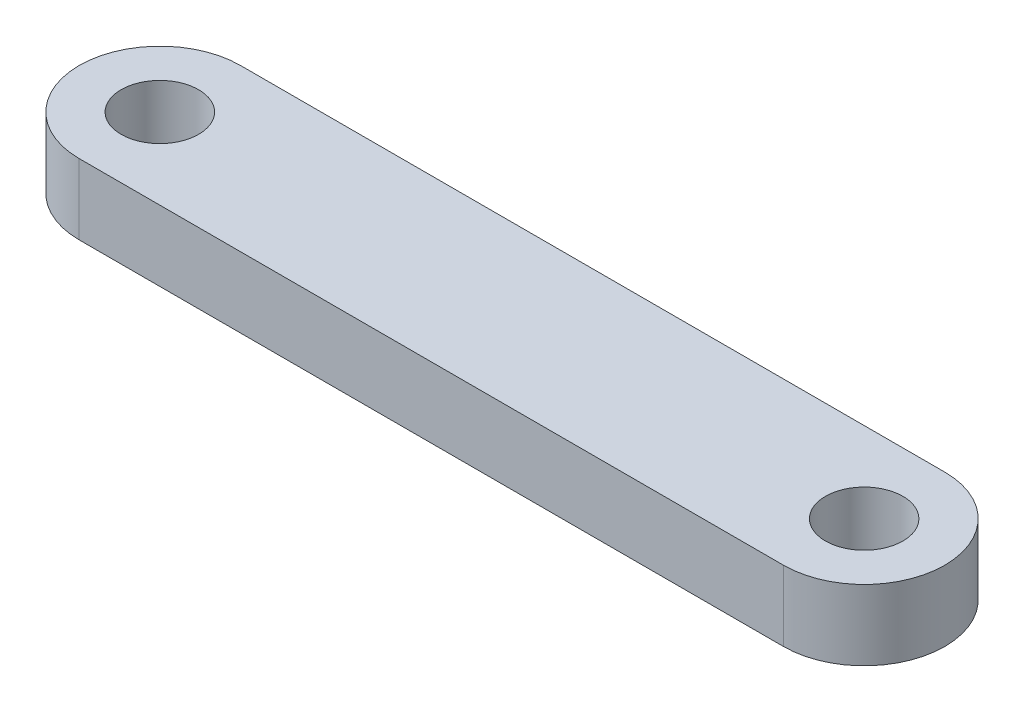
ISO-10303-21;
HEADER;
FILE_DESCRIPTION(('STEP AP214'),'2;1');
FILE_NAME('part.step','',(''),(''),'','','');
FILE_SCHEMA(('AUTOMOTIVE_DESIGN { 1 0 10303 214 1 1 1 1 }'));
ENDSEC;
DATA;
#1=APPLICATION_CONTEXT('core data for automotive mechanical design processes');
#2=APPLICATION_PROTOCOL_DEFINITION('international standard','automotive_design',2000,#1);
#3=PRODUCT_CONTEXT('',#1,'mechanical');
#4=PRODUCT('Part','Part','',(#3));
#5=PRODUCT_RELATED_PRODUCT_CATEGORY('part','',(#4));
#6=PRODUCT_DEFINITION_FORMATION('','',#4);
#7=PRODUCT_DEFINITION_CONTEXT('part definition',#1,'design');
#8=PRODUCT_DEFINITION('design','',#6,#7);
#9=PRODUCT_DEFINITION_SHAPE('','',#8);
#10=(LENGTH_UNIT() NAMED_UNIT(*) SI_UNIT(.MILLI.,.METRE.));
#11=(NAMED_UNIT(*) PLANE_ANGLE_UNIT() SI_UNIT($,.RADIAN.));
#12=(NAMED_UNIT(*) SI_UNIT($,.STERADIAN.) SOLID_ANGLE_UNIT());
#13=UNCERTAINTY_MEASURE_WITH_UNIT(LENGTH_MEASURE(1.E-05),#10,'distance_accuracy_value','');
#14=(GEOMETRIC_REPRESENTATION_CONTEXT(3) GLOBAL_UNCERTAINTY_ASSIGNED_CONTEXT((#13)) GLOBAL_UNIT_ASSIGNED_CONTEXT((#10,
#11,#12)) REPRESENTATION_CONTEXT('',''));
#15=CARTESIAN_POINT('',(0.,0.,0.));
#16=DIRECTION('',(0.,0.,1.));
#17=DIRECTION('',(1.,0.,0.));
#18=AXIS2_PLACEMENT_3D('',#15,#16,#17);
#19=CARTESIAN_POINT('',(0.,3.,-3.435));
#20=DIRECTION('',(0.,1.,0.));
#21=DIRECTION('',(0.,0.,1.));
#22=AXIS2_PLACEMENT_3D('',#19,#20,#21);
#23=PLANE('',#22);
#24=CARTESIAN_POINT('',(0.,3.,-3.435));
#25=DIRECTION('',(0.,1.,0.));
#26=DIRECTION('',(0.,0.,1.));
#27=AXIS2_PLACEMENT_3D('',#24,#25,#26);
#28=CIRCLE('',#27,1.65);
#29=CARTESIAN_POINT('',(0.,3.,-1.785));
#30=VERTEX_POINT('',#29);
#31=EDGE_CURVE('E104',#30,#30,#28,.T.);
#32=ORIENTED_EDGE('',*,*,#31,.F.);
#33=EDGE_LOOP('',(#32));
#34=FACE_BOUND('',#33,.T.);
#35=CARTESIAN_POINT('',(0.,3.,-3.435));
#36=DIRECTION('',(0.,1.,0.));
#37=DIRECTION('',(0.,0.,1.));
#38=AXIS2_PLACEMENT_3D('',#35,#36,#37);
#39=CIRCLE('',#38,3.435);
#40=CARTESIAN_POINT('',(0.,3.,-6.87));
#41=VERTEX_POINT('',#40);
#42=CARTESIAN_POINT('',(0.,3.,0.));
#43=VERTEX_POINT('',#42);
#44=EDGE_CURVE('E89',#41,#43,#39,.T.);
#45=ORIENTED_EDGE('',*,*,#44,.T.);
#46=DIRECTION('',(1.,0.,0.));
#47=VECTOR('',#46,1.);
#48=CARTESIAN_POINT('',(0.,3.,0.));
#49=LINE('',#48,#47);
#50=CARTESIAN_POINT('',(30.,3.,0.));
#51=VERTEX_POINT('',#50);
#52=EDGE_CURVE('E84',#43,#51,#49,.T.);
#53=ORIENTED_EDGE('',*,*,#52,.T.);
#54=CARTESIAN_POINT('',(30.,3.,-3.43500000000001));
#55=DIRECTION('',(0.,1.,0.));
#56=DIRECTION('',(0.,0.,1.));
#57=AXIS2_PLACEMENT_3D('',#54,#55,#56);
#58=CIRCLE('',#57,3.43500000000001);
#59=CARTESIAN_POINT('',(30.,3.,-6.87000000000001));
#60=VERTEX_POINT('',#59);
#61=EDGE_CURVE('E87',#51,#60,#58,.T.);
#62=ORIENTED_EDGE('',*,*,#61,.T.);
#63=DIRECTION('',(-1.,0.,0.));
#64=VECTOR('',#63,1.);
#65=CARTESIAN_POINT('',(0.,3.,-6.87));
#66=LINE('',#65,#64);
#67=EDGE_CURVE('E54',#60,#41,#66,.T.);
#68=ORIENTED_EDGE('',*,*,#67,.T.);
#69=EDGE_LOOP('',(#45,#53,#62,#68));
#70=FACE_BOUND('',#69,.T.);
#71=CARTESIAN_POINT('',(30.,3.,-3.43500000000001));
#72=DIRECTION('',(0.,1.,0.));
#73=DIRECTION('',(0.,0.,1.));
#74=AXIS2_PLACEMENT_3D('',#71,#72,#73);
#75=CIRCLE('',#74,1.65);
#76=CARTESIAN_POINT('',(30.,3.,-1.785));
#77=VERTEX_POINT('',#76);
#78=EDGE_CURVE('E119',#77,#77,#75,.T.);
#79=ORIENTED_EDGE('',*,*,#78,.F.);
#80=EDGE_LOOP('',(#79));
#81=FACE_BOUND('',#80,.T.);
#82=ADVANCED_FACE('F37',(#34,#70,#81),#23,.T.);
#83=CARTESIAN_POINT('',(0.,0.,-3.435));
#84=DIRECTION('',(0.,1.,0.));
#85=DIRECTION('',(0.,0.,1.));
#86=AXIS2_PLACEMENT_3D('',#83,#84,#85);
#87=PLANE('',#86);
#88=CARTESIAN_POINT('',(0.,0.,-3.435));
#89=DIRECTION('',(0.,1.,0.));
#90=DIRECTION('',(0.,0.,1.));
#91=AXIS2_PLACEMENT_3D('',#88,#89,#90);
#92=CIRCLE('',#91,3.435);
#93=CARTESIAN_POINT('',(0.,0.,-6.87));
#94=VERTEX_POINT('',#93);
#95=CARTESIAN_POINT('',(0.,0.,0.));
#96=VERTEX_POINT('',#95);
#97=EDGE_CURVE('E101',#94,#96,#92,.T.);
#98=ORIENTED_EDGE('',*,*,#97,.F.);
#99=DIRECTION('',(-1.,0.,0.));
#100=VECTOR('',#99,1.);
#101=CARTESIAN_POINT('',(0.,0.,-6.87));
#102=LINE('',#101,#100);
#103=CARTESIAN_POINT('',(30.,0.,-6.87000000000001));
#104=VERTEX_POINT('',#103);
#105=EDGE_CURVE('E77',#104,#94,#102,.T.);
#106=ORIENTED_EDGE('',*,*,#105,.F.);
#107=CARTESIAN_POINT('',(30.,0.,-3.43500000000001));
#108=DIRECTION('',(0.,1.,0.));
#109=DIRECTION('',(0.,0.,1.));
#110=AXIS2_PLACEMENT_3D('',#107,#108,#109);
#111=CIRCLE('',#110,3.43500000000001);
#112=CARTESIAN_POINT('',(30.,0.,0.));
#113=VERTEX_POINT('',#112);
#114=EDGE_CURVE('E71',#113,#104,#111,.T.);
#115=ORIENTED_EDGE('',*,*,#114,.F.);
#116=DIRECTION('',(1.,0.,0.));
#117=VECTOR('',#116,1.);
#118=CARTESIAN_POINT('',(0.,0.,0.));
#119=LINE('',#118,#117);
#120=EDGE_CURVE('E93',#96,#113,#119,.T.);
#121=ORIENTED_EDGE('',*,*,#120,.F.);
#122=EDGE_LOOP('',(#98,#106,#115,#121));
#123=FACE_BOUND('',#122,.T.);
#124=CARTESIAN_POINT('',(0.,0.,-3.435));
#125=DIRECTION('',(0.,1.,0.));
#126=DIRECTION('',(0.,0.,1.));
#127=AXIS2_PLACEMENT_3D('',#124,#125,#126);
#128=CIRCLE('',#127,1.65);
#129=CARTESIAN_POINT('',(0.,0.,-1.785));
#130=VERTEX_POINT('',#129);
#131=EDGE_CURVE('E116',#130,#130,#128,.T.);
#132=ORIENTED_EDGE('',*,*,#131,.T.);
#133=EDGE_LOOP('',(#132));
#134=FACE_BOUND('',#133,.T.);
#135=CARTESIAN_POINT('',(30.,0.,-3.43500000000001));
#136=DIRECTION('',(0.,1.,0.));
#137=DIRECTION('',(0.,0.,1.));
#138=AXIS2_PLACEMENT_3D('',#135,#136,#137);
#139=CIRCLE('',#138,1.65);
#140=CARTESIAN_POINT('',(30.,0.,-1.785));
#141=VERTEX_POINT('',#140);
#142=EDGE_CURVE('E122',#141,#141,#139,.T.);
#143=ORIENTED_EDGE('',*,*,#142,.T.);
#144=EDGE_LOOP('',(#143));
#145=FACE_BOUND('',#144,.T.);
#146=ADVANCED_FACE('F112',(#123,#134,#145),#87,.F.);
#147=CARTESIAN_POINT('',(0.,3.,-3.435));
#148=DIRECTION('',(0.,-1.,0.));
#149=DIRECTION('',(0.,0.,-1.));
#150=AXIS2_PLACEMENT_3D('',#147,#148,#149);
#151=CYLINDRICAL_SURFACE('',#150,3.435);
#152=ORIENTED_EDGE('',*,*,#97,.T.);
#153=DIRECTION('',(0.,-1.,0.));
#154=VECTOR('',#153,1.);
#155=CARTESIAN_POINT('',(0.,3.,0.));
#156=LINE('',#155,#154);
#157=EDGE_CURVE('E11',#43,#96,#156,.T.);
#158=ORIENTED_EDGE('',*,*,#157,.F.);
#159=ORIENTED_EDGE('',*,*,#44,.F.);
#160=DIRECTION('',(0.,-1.,0.));
#161=VECTOR('',#160,1.);
#162=CARTESIAN_POINT('',(0.,3.,-6.87));
#163=LINE('',#162,#161);
#164=EDGE_CURVE('E97',#41,#94,#163,.T.);
#165=ORIENTED_EDGE('',*,*,#164,.T.);
#166=EDGE_LOOP('',(#152,#158,#159,#165));
#167=FACE_BOUND('',#166,.T.);
#168=ADVANCED_FACE('F39',(#167),#151,.T.);
#169=CARTESIAN_POINT('',(0.,3.,0.));
#170=DIRECTION('',(0.,0.,-1.));
#171=DIRECTION('',(-1.,0.,0.));
#172=AXIS2_PLACEMENT_3D('',#169,#170,#171);
#173=PLANE('',#172);
#174=ORIENTED_EDGE('',*,*,#120,.T.);
#175=DIRECTION('',(0.,-1.,0.));
#176=VECTOR('',#175,1.);
#177=CARTESIAN_POINT('',(30.,3.,0.));
#178=LINE('',#177,#176);
#179=EDGE_CURVE('E46',#51,#113,#178,.T.);
#180=ORIENTED_EDGE('',*,*,#179,.F.);
#181=ORIENTED_EDGE('',*,*,#52,.F.);
#182=ORIENTED_EDGE('',*,*,#157,.T.);
#183=EDGE_LOOP('',(#174,#180,#181,#182));
#184=FACE_BOUND('',#183,.T.);
#185=ADVANCED_FACE('F92',(#184),#173,.F.);
#186=CARTESIAN_POINT('',(30.,3.,-3.43500000000001));
#187=DIRECTION('',(0.,-1.,0.));
#188=DIRECTION('',(0.,0.,-1.));
#189=AXIS2_PLACEMENT_3D('',#186,#187,#188);
#190=CYLINDRICAL_SURFACE('',#189,3.43500000000001);
#191=ORIENTED_EDGE('',*,*,#114,.T.);
#192=DIRECTION('',(0.,-1.,0.));
#193=VECTOR('',#192,1.);
#194=CARTESIAN_POINT('',(30.,3.,-6.87000000000001));
#195=LINE('',#194,#193);
#196=EDGE_CURVE('E94',#60,#104,#195,.T.);
#197=ORIENTED_EDGE('',*,*,#196,.F.);
#198=ORIENTED_EDGE('',*,*,#61,.F.);
#199=ORIENTED_EDGE('',*,*,#179,.T.);
#200=EDGE_LOOP('',(#191,#197,#198,#199));
#201=FACE_BOUND('',#200,.T.);
#202=ADVANCED_FACE('F95',(#201),#190,.T.);
#203=CARTESIAN_POINT('',(0.,3.,-6.87));
#204=DIRECTION('',(0.,0.,1.));
#205=DIRECTION('',(1.,0.,0.));
#206=AXIS2_PLACEMENT_3D('',#203,#204,#205);
#207=PLANE('',#206);
#208=ORIENTED_EDGE('',*,*,#105,.T.);
#209=ORIENTED_EDGE('',*,*,#164,.F.);
#210=ORIENTED_EDGE('',*,*,#67,.F.);
#211=ORIENTED_EDGE('',*,*,#196,.T.);
#212=EDGE_LOOP('',(#208,#209,#210,#211));
#213=FACE_BOUND('',#212,.T.);
#214=ADVANCED_FACE('F109',(#213),#207,.F.);
#215=CARTESIAN_POINT('',(0.,3.,-3.435));
#216=DIRECTION('',(0.,-1.,0.));
#217=DIRECTION('',(0.,0.,-1.));
#218=AXIS2_PLACEMENT_3D('',#215,#216,#217);
#219=CYLINDRICAL_SURFACE('',#218,1.65);
#220=ORIENTED_EDGE('',*,*,#31,.T.);
#221=EDGE_LOOP('',(#220));
#222=FACE_BOUND('',#221,.T.);
#223=ORIENTED_EDGE('',*,*,#131,.F.);
#224=EDGE_LOOP('',(#223));
#225=FACE_BOUND('',#224,.T.);
#226=ADVANCED_FACE('F139',(#222,#225),#219,.F.);
#227=CARTESIAN_POINT('',(30.,3.,-3.43500000000001));
#228=DIRECTION('',(0.,-1.,0.));
#229=DIRECTION('',(0.,0.,-1.));
#230=AXIS2_PLACEMENT_3D('',#227,#228,#229);
#231=CYLINDRICAL_SURFACE('',#230,1.65);
#232=ORIENTED_EDGE('',*,*,#78,.T.);
#233=EDGE_LOOP('',(#232));
#234=FACE_BOUND('',#233,.T.);
#235=ORIENTED_EDGE('',*,*,#142,.F.);
#236=EDGE_LOOP('',(#235));
#237=FACE_BOUND('',#236,.T.);
#238=ADVANCED_FACE('F128',(#234,#237),#231,.F.);
#239=CLOSED_SHELL('',(#82,#146,#168,#185,#202,#214,#226,#238));
#240=MANIFOLD_SOLID_BREP('B2',#239);
#241=ADVANCED_BREP_SHAPE_REPRESENTATION('',(#18,#240),#14);
#242=SHAPE_DEFINITION_REPRESENTATION(#9,#241);
ENDSEC;
END-ISO-10303-21;
